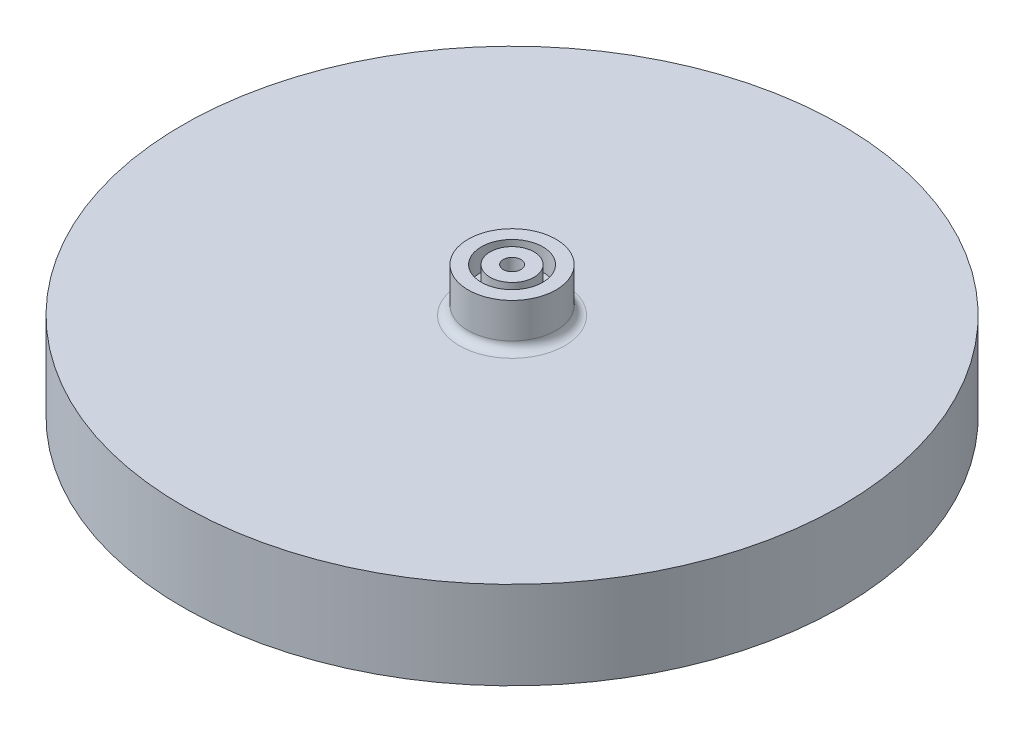
ISO-10303-21;
HEADER;
FILE_DESCRIPTION(('STEP AP214'),'2;1');
FILE_NAME('part.step','',(''),(''),'','','');
FILE_SCHEMA(('AUTOMOTIVE_DESIGN { 1 0 10303 214 1 1 1 1 }'));
ENDSEC;
DATA;
#1=APPLICATION_CONTEXT('core data for automotive mechanical design processes');
#2=APPLICATION_PROTOCOL_DEFINITION('international standard','automotive_design',2000,#1);
#3=PRODUCT_CONTEXT('',#1,'mechanical');
#4=PRODUCT('Part','Part','',(#3));
#5=PRODUCT_RELATED_PRODUCT_CATEGORY('part','',(#4));
#6=PRODUCT_DEFINITION_FORMATION('','',#4);
#7=PRODUCT_DEFINITION_CONTEXT('part definition',#1,'design');
#8=PRODUCT_DEFINITION('design','',#6,#7);
#9=PRODUCT_DEFINITION_SHAPE('','',#8);
#10=(LENGTH_UNIT() NAMED_UNIT(*) SI_UNIT(.MILLI.,.METRE.));
#11=(NAMED_UNIT(*) PLANE_ANGLE_UNIT() SI_UNIT($,.RADIAN.));
#12=(NAMED_UNIT(*) SI_UNIT($,.STERADIAN.) SOLID_ANGLE_UNIT());
#13=UNCERTAINTY_MEASURE_WITH_UNIT(LENGTH_MEASURE(1.E-05),#10,'distance_accuracy_value','');
#14=(GEOMETRIC_REPRESENTATION_CONTEXT(3) GLOBAL_UNCERTAINTY_ASSIGNED_CONTEXT((#13)) GLOBAL_UNIT_ASSIGNED_CONTEXT((#10,
#11,#12)) REPRESENTATION_CONTEXT('',''));
#15=CARTESIAN_POINT('',(0.,0.,0.));
#16=DIRECTION('',(0.,0.,1.));
#17=DIRECTION('',(1.,0.,0.));
#18=AXIS2_PLACEMENT_3D('',#15,#16,#17);
#19=CARTESIAN_POINT('',(0.,0.,0.));
#20=DIRECTION('',(0.,-1.,0.));
#21=DIRECTION('',(1.,0.,0.));
#22=AXIS2_PLACEMENT_3D('',#19,#20,#21);
#23=PLANE('',#22);
#24=CARTESIAN_POINT('',(0.,0.,0.));
#25=DIRECTION('',(0.,-1.,0.));
#26=DIRECTION('',(1.,0.,0.));
#27=AXIS2_PLACEMENT_3D('',#24,#25,#26);
#28=CIRCLE('',#27,2.);
#29=CARTESIAN_POINT('',(2.,0.,0.));
#30=VERTEX_POINT('',#29);
#31=EDGE_CURVE('E49',#30,#30,#28,.T.);
#32=ORIENTED_EDGE('',*,*,#31,.F.);
#33=EDGE_LOOP('',(#32));
#34=FACE_BOUND('',#33,.T.);
#35=ADVANCED_FACE('F38',(#34),#23,.F.);
#36=CARTESIAN_POINT('',(6.79792798608928E-13,-198.17593382572,0.));
#37=DIRECTION('',(0.,-1.,0.));
#38=DIRECTION('',(1.,0.,0.));
#39=AXIS2_PLACEMENT_3D('',#36,#37,#38);
#40=CYLINDRICAL_SURFACE('',#39,1.99999999999999);
#41=CARTESIAN_POINT('',(0.,8.00000000000001,0.));
#42=DIRECTION('',(0.,-1.,0.));
#43=DIRECTION('',(1.,0.,0.));
#44=AXIS2_PLACEMENT_3D('',#41,#42,#43);
#45=CIRCLE('',#44,1.99999999999997);
#46=CARTESIAN_POINT('',(1.99999999999995,8.00000000000001,0.));
#47=VERTEX_POINT('',#46);
#48=EDGE_CURVE('E53',#47,#47,#45,.T.);
#49=ORIENTED_EDGE('',*,*,#48,.F.);
#50=EDGE_LOOP('',(#49));
#51=FACE_BOUND('',#50,.T.);
#52=ORIENTED_EDGE('',*,*,#31,.T.);
#53=EDGE_LOOP('',(#52));
#54=FACE_BOUND('',#53,.T.);
#55=ADVANCED_FACE('F98',(#51,#54),#40,.F.);
#56=CARTESIAN_POINT('',(-2.,8.00000000000001,0.));
#57=DIRECTION('',(0.,-1.,0.));
#58=DIRECTION('',(1.,0.,0.));
#59=AXIS2_PLACEMENT_3D('',#56,#57,#58);
#60=PLANE('',#59);
#61=CARTESIAN_POINT('',(0.,8.00000000000004,0.));
#62=DIRECTION('',(0.,-1.,0.));
#63=DIRECTION('',(1.,0.,0.));
#64=AXIS2_PLACEMENT_3D('',#61,#62,#63);
#65=CIRCLE('',#64,4.99999999999997);
#66=CARTESIAN_POINT('',(4.99999999999995,8.00000000000005,0.));
#67=VERTEX_POINT('',#66);
#68=EDGE_CURVE('E58',#67,#67,#65,.T.);
#69=ORIENTED_EDGE('',*,*,#68,.F.);
#70=EDGE_LOOP('',(#69));
#71=FACE_BOUND('',#70,.T.);
#72=ORIENTED_EDGE('',*,*,#48,.T.);
#73=EDGE_LOOP('',(#72));
#74=FACE_BOUND('',#73,.T.);
#75=ADVANCED_FACE('F103',(#71,#74),#60,.F.);
#76=CARTESIAN_POINT('',(6.79792798608928E-13,-198.17593382572,0.));
#77=DIRECTION('',(0.,-1.,0.));
#78=DIRECTION('',(1.,0.,0.));
#79=AXIS2_PLACEMENT_3D('',#76,#77,#78);
#80=CYLINDRICAL_SURFACE('',#79,4.99999999999998);
#81=CARTESIAN_POINT('',(0.,3.00000000000003,0.));
#82=DIRECTION('',(0.,-1.,0.));
#83=DIRECTION('',(1.,0.,0.));
#84=AXIS2_PLACEMENT_3D('',#81,#82,#83);
#85=CIRCLE('',#84,4.99999999999999);
#86=CARTESIAN_POINT('',(4.99999999999998,3.00000000000005,0.));
#87=VERTEX_POINT('',#86);
#88=EDGE_CURVE('E61',#87,#87,#85,.T.);
#89=ORIENTED_EDGE('',*,*,#88,.F.);
#90=EDGE_LOOP('',(#89));
#91=FACE_BOUND('',#90,.T.);
#92=ORIENTED_EDGE('',*,*,#68,.T.);
#93=EDGE_LOOP('',(#92));
#94=FACE_BOUND('',#93,.T.);
#95=ADVANCED_FACE('F110',(#91,#94),#80,.T.);
#96=CARTESIAN_POINT('',(-5.,3.,0.));
#97=DIRECTION('',(0.,-1.,0.));
#98=DIRECTION('',(1.,0.,0.));
#99=AXIS2_PLACEMENT_3D('',#96,#97,#98);
#100=PLANE('',#99);
#101=CARTESIAN_POINT('',(0.,3.00000000000003,0.));
#102=DIRECTION('',(0.,-1.,0.));
#103=DIRECTION('',(1.,0.,0.));
#104=AXIS2_PLACEMENT_3D('',#101,#102,#103);
#105=CIRCLE('',#104,6.99999999999999);
#106=CARTESIAN_POINT('',(6.99999999999998,3.00000000000005,0.));
#107=VERTEX_POINT('',#106);
#108=EDGE_CURVE('E64',#107,#107,#105,.T.);
#109=ORIENTED_EDGE('',*,*,#108,.F.);
#110=EDGE_LOOP('',(#109));
#111=FACE_BOUND('',#110,.T.);
#112=ORIENTED_EDGE('',*,*,#88,.T.);
#113=EDGE_LOOP('',(#112));
#114=FACE_BOUND('',#113,.T.);
#115=ADVANCED_FACE('F114',(#111,#114),#100,.F.);
#116=CARTESIAN_POINT('',(6.79792798608928E-13,-198.17593382572,0.));
#117=DIRECTION('',(0.,-1.,0.));
#118=DIRECTION('',(1.,0.,0.));
#119=AXIS2_PLACEMENT_3D('',#116,#117,#118);
#120=CYLINDRICAL_SURFACE('',#119,6.99999999999998);
#121=CARTESIAN_POINT('',(0.,8.00000000000004,0.));
#122=DIRECTION('',(0.,-1.,0.));
#123=DIRECTION('',(1.,0.,0.));
#124=AXIS2_PLACEMENT_3D('',#121,#122,#123);
#125=CIRCLE('',#124,6.99999999999997);
#126=CARTESIAN_POINT('',(6.99999999999995,8.00000000000006,0.));
#127=VERTEX_POINT('',#126);
#128=EDGE_CURVE('E67',#127,#127,#125,.T.);
#129=ORIENTED_EDGE('',*,*,#128,.F.);
#130=EDGE_LOOP('',(#129));
#131=FACE_BOUND('',#130,.T.);
#132=ORIENTED_EDGE('',*,*,#108,.T.);
#133=EDGE_LOOP('',(#132));
#134=FACE_BOUND('',#133,.T.);
#135=ADVANCED_FACE('F118',(#131,#134),#120,.F.);
#136=CARTESIAN_POINT('',(-7.,8.00000000000001,0.));
#137=DIRECTION('',(0.,-1.,0.));
#138=DIRECTION('',(1.,0.,0.));
#139=AXIS2_PLACEMENT_3D('',#136,#137,#138);
#140=PLANE('',#139);
#141=CARTESIAN_POINT('',(0.,8.00000000000004,0.));
#142=DIRECTION('',(0.,-1.,0.));
#143=DIRECTION('',(1.,0.,0.));
#144=AXIS2_PLACEMENT_3D('',#141,#142,#143);
#145=CIRCLE('',#144,9.99999999999997);
#146=CARTESIAN_POINT('',(9.99999999999994,8.00000000000007,0.));
#147=VERTEX_POINT('',#146);
#148=EDGE_CURVE('E70',#147,#147,#145,.T.);
#149=ORIENTED_EDGE('',*,*,#148,.F.);
#150=EDGE_LOOP('',(#149));
#151=FACE_BOUND('',#150,.T.);
#152=ORIENTED_EDGE('',*,*,#128,.T.);
#153=EDGE_LOOP('',(#152));
#154=FACE_BOUND('',#153,.T.);
#155=ADVANCED_FACE('F95',(#151,#154),#140,.F.);
#156=CARTESIAN_POINT('',(6.79792798608928E-13,-198.17593382572,0.));
#157=DIRECTION('',(0.,-1.,0.));
#158=DIRECTION('',(1.,0.,0.));
#159=AXIS2_PLACEMENT_3D('',#156,#157,#158);
#160=CYLINDRICAL_SURFACE('',#159,9.99999999999999);
#161=CARTESIAN_POINT('',(0.,1.38777878078145E-13,0.));
#162=DIRECTION('',(0.,-1.,0.));
#163=DIRECTION('',(1.,0.,0.));
#164=AXIS2_PLACEMENT_3D('',#161,#162,#163);
#165=CIRCLE('',#164,9.99999999999999);
#166=CARTESIAN_POINT('',(9.99999999999999,1.73080368067002E-13,0.));
#167=VERTEX_POINT('',#166);
#168=EDGE_CURVE('E10',#167,#167,#165,.F.);
#169=ORIENTED_EDGE('',*,*,#168,.T.);
#170=EDGE_LOOP('',(#169));
#171=FACE_BOUND('',#170,.T.);
#172=ORIENTED_EDGE('',*,*,#148,.T.);
#173=EDGE_LOOP('',(#172));
#174=FACE_BOUND('',#173,.T.);
#175=ADVANCED_FACE('F90',(#171,#174),#160,.T.);
#176=CARTESIAN_POINT('',(-10.,-1.99999999999989,0.));
#177=DIRECTION('',(0.,-1.,0.));
#178=DIRECTION('',(1.,0.,0.));
#179=AXIS2_PLACEMENT_3D('',#176,#177,#178);
#180=PLANE('',#179);
#181=CARTESIAN_POINT('',(0.,-1.99999999999986,0.));
#182=DIRECTION('',(0.,-1.,0.));
#183=DIRECTION('',(1.,0.,0.));
#184=AXIS2_PLACEMENT_3D('',#181,#182,#183);
#185=CIRCLE('',#184,12.);
#186=CARTESIAN_POINT('',(12.,-1.99999999999982,0.));
#187=VERTEX_POINT('',#186);
#188=EDGE_CURVE('E45',#187,#187,#185,.T.);
#189=ORIENTED_EDGE('',*,*,#188,.T.);
#190=EDGE_LOOP('',(#189));
#191=FACE_BOUND('',#190,.T.);
#192=CARTESIAN_POINT('',(0.,-1.99999999999975,0.));
#193=DIRECTION('',(0.,-1.,0.));
#194=DIRECTION('',(1.,0.,0.));
#195=AXIS2_PLACEMENT_3D('',#192,#193,#194);
#196=CIRCLE('',#195,75.);
#197=CARTESIAN_POINT('',(75.,-1.99999999999949,0.));
#198=VERTEX_POINT('',#197);
#199=EDGE_CURVE('E73',#198,#198,#196,.T.);
#200=ORIENTED_EDGE('',*,*,#199,.F.);
#201=EDGE_LOOP('',(#200));
#202=FACE_BOUND('',#201,.T.);
#203=ADVANCED_FACE('F85',(#191,#202),#180,.F.);
#204=CARTESIAN_POINT('',(6.79792798608928E-13,-198.17593382572,0.));
#205=DIRECTION('',(0.,-1.,0.));
#206=DIRECTION('',(1.,0.,0.));
#207=AXIS2_PLACEMENT_3D('',#204,#205,#206);
#208=CYLINDRICAL_SURFACE('',#207,75.);
#209=CARTESIAN_POINT('',(0.,-21.9999999999998,0.));
#210=DIRECTION('',(0.,-1.,0.));
#211=DIRECTION('',(1.,0.,0.));
#212=AXIS2_PLACEMENT_3D('',#209,#210,#211);
#213=CIRCLE('',#212,75.0000000000001);
#214=CARTESIAN_POINT('',(75.0000000000001,-21.9999999999995,0.));
#215=VERTEX_POINT('',#214);
#216=EDGE_CURVE('E76',#215,#215,#213,.T.);
#217=ORIENTED_EDGE('',*,*,#216,.F.);
#218=EDGE_LOOP('',(#217));
#219=FACE_BOUND('',#218,.T.);
#220=ORIENTED_EDGE('',*,*,#199,.T.);
#221=EDGE_LOOP('',(#220));
#222=FACE_BOUND('',#221,.T.);
#223=ADVANCED_FACE('F82',(#219,#222),#208,.T.);
#224=CARTESIAN_POINT('',(-75.,-22.0000000000001,0.));
#225=DIRECTION('',(0.,1.,0.));
#226=DIRECTION('',(-1.,0.,0.));
#227=AXIS2_PLACEMENT_3D('',#224,#225,#226);
#228=PLANE('',#227);
#229=ORIENTED_EDGE('',*,*,#216,.T.);
#230=EDGE_LOOP('',(#229));
#231=FACE_BOUND('',#230,.T.);
#232=ADVANCED_FACE('F80',(#231),#228,.F.);
#233=CARTESIAN_POINT('',(0.,1.38777878078145E-13,0.));
#234=DIRECTION('',(0.,-1.,0.));
#235=DIRECTION('',(1.,0.,0.));
#236=AXIS2_PLACEMENT_3D('',#233,#234,#235);
#237=TOROIDAL_SURFACE('',#236,12.,2.);
#238=ORIENTED_EDGE('',*,*,#168,.F.);
#239=EDGE_LOOP('',(#238));
#240=FACE_BOUND('',#239,.T.);
#241=ORIENTED_EDGE('',*,*,#188,.F.);
#242=EDGE_LOOP('',(#241));
#243=FACE_BOUND('',#242,.T.);
#244=ADVANCED_FACE('F40',(#240,#243),#237,.F.);
#245=CLOSED_SHELL('',(#35,#55,#75,#95,#115,#135,#155,#175,#203,#223,#232,#244));
#246=MANIFOLD_SOLID_BREP('B2',#245);
#247=ADVANCED_BREP_SHAPE_REPRESENTATION('',(#18,#246),#14);
#248=SHAPE_DEFINITION_REPRESENTATION(#9,#247);
ENDSEC;
END-ISO-10303-21;
